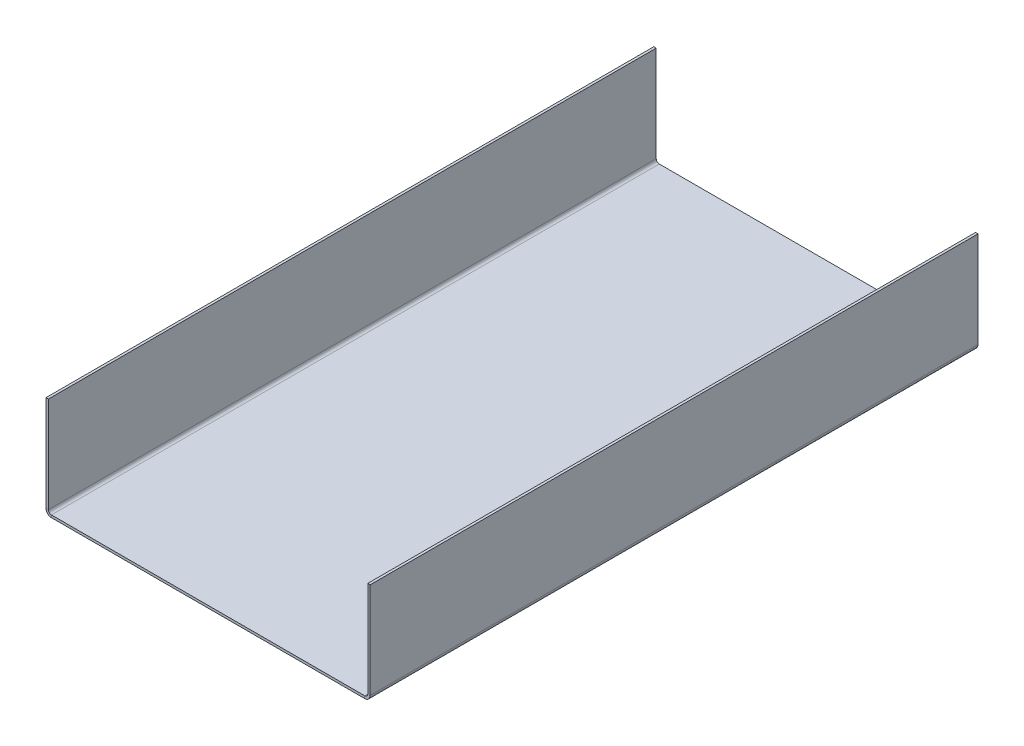
ISO-10303-21;
HEADER;
FILE_DESCRIPTION(('STEP AP214'),'2;1');
FILE_NAME('part.step','',(''),(''),'','','');
FILE_SCHEMA(('AUTOMOTIVE_DESIGN { 1 0 10303 214 1 1 1 1 }'));
ENDSEC;
DATA;
#1=APPLICATION_CONTEXT('core data for automotive mechanical design processes');
#2=APPLICATION_PROTOCOL_DEFINITION('international standard','automotive_design',2000,#1);
#3=PRODUCT_CONTEXT('',#1,'mechanical');
#4=PRODUCT('Part','Part','',(#3));
#5=PRODUCT_RELATED_PRODUCT_CATEGORY('part','',(#4));
#6=PRODUCT_DEFINITION_FORMATION('','',#4);
#7=PRODUCT_DEFINITION_CONTEXT('part definition',#1,'design');
#8=PRODUCT_DEFINITION('design','',#6,#7);
#9=PRODUCT_DEFINITION_SHAPE('','',#8);
#10=(LENGTH_UNIT() NAMED_UNIT(*) SI_UNIT(.MILLI.,.METRE.));
#11=(NAMED_UNIT(*) PLANE_ANGLE_UNIT() SI_UNIT($,.RADIAN.));
#12=(NAMED_UNIT(*) SI_UNIT($,.STERADIAN.) SOLID_ANGLE_UNIT());
#13=UNCERTAINTY_MEASURE_WITH_UNIT(LENGTH_MEASURE(1.E-05),#10,'distance_accuracy_value','');
#14=(GEOMETRIC_REPRESENTATION_CONTEXT(3) GLOBAL_UNCERTAINTY_ASSIGNED_CONTEXT((#13)) GLOBAL_UNIT_ASSIGNED_CONTEXT((#10,
#11,#12)) REPRESENTATION_CONTEXT('',''));
#15=CARTESIAN_POINT('',(0.,0.,0.));
#16=DIRECTION('',(0.,0.,1.));
#17=DIRECTION('',(1.,0.,0.));
#18=AXIS2_PLACEMENT_3D('',#15,#16,#17);
#19=CARTESIAN_POINT('',(199.77608,0.,381.));
#20=DIRECTION('',(0.,0.,1.));
#21=DIRECTION('',(1.,0.,0.));
#22=AXIS2_PLACEMENT_3D('',#19,#20,#21);
#23=PLANE('',#22);
#24=DIRECTION('',(0.,1.,0.));
#25=VECTOR('',#24,1.);
#26=CARTESIAN_POINT('',(199.77608,0.,381.));
#27=LINE('',#26,#25);
#28=CARTESIAN_POINT('',(199.77608,0.,381.));
#29=VERTEX_POINT('',#28);
#30=CARTESIAN_POINT('',(199.77608,1.51892,381.));
#31=VERTEX_POINT('',#30);
#32=EDGE_CURVE('E11',#29,#31,#27,.T.);
#33=ORIENTED_EDGE('',*,*,#32,.F.);
#34=CARTESIAN_POINT('',(199.77608,3.42392,381.));
#35=DIRECTION('',(0.,0.,1.));
#36=DIRECTION('',(1.,0.,0.));
#37=AXIS2_PLACEMENT_3D('',#34,#35,#36);
#38=CIRCLE('',#37,3.42392);
#39=CARTESIAN_POINT('',(203.2,3.42392,381.));
#40=VERTEX_POINT('',#39);
#41=EDGE_CURVE('E246',#40,#29,#38,.F.);
#42=ORIENTED_EDGE('',*,*,#41,.F.);
#43=DIRECTION('',(1.,0.,0.));
#44=VECTOR('',#43,1.);
#45=CARTESIAN_POINT('',(201.68108,3.42392,381.));
#46=LINE('',#45,#44);
#47=CARTESIAN_POINT('',(201.68108,3.42392,381.));
#48=VERTEX_POINT('',#47);
#49=EDGE_CURVE('E44',#48,#40,#46,.T.);
#50=ORIENTED_EDGE('',*,*,#49,.F.);
#51=CARTESIAN_POINT('',(199.77608,3.42392,381.));
#52=DIRECTION('',(0.,0.,1.));
#53=DIRECTION('',(1.,0.,0.));
#54=AXIS2_PLACEMENT_3D('',#51,#52,#53);
#55=CIRCLE('',#54,1.905);
#56=EDGE_CURVE('E145',#48,#31,#55,.F.);
#57=ORIENTED_EDGE('',*,*,#56,.T.);
#58=EDGE_LOOP('',(#33,#42,#50,#57));
#59=FACE_BOUND('',#58,.T.);
#60=ADVANCED_FACE('F36',(#59),#23,.T.);
#61=CARTESIAN_POINT('',(201.68108,3.42392,381.));
#62=DIRECTION('',(0.,0.,1.));
#63=DIRECTION('',(1.,0.,0.));
#64=AXIS2_PLACEMENT_3D('',#61,#62,#63);
#65=PLANE('',#64);
#66=DIRECTION('',(-1.,0.,0.));
#67=VECTOR('',#66,1.);
#68=CARTESIAN_POINT('',(0.,0.,381.));
#69=LINE('',#68,#67);
#70=CARTESIAN_POINT('',(3.42392,0.,381.));
#71=VERTEX_POINT('',#70);
#72=EDGE_CURVE('E139',#29,#71,#69,.T.);
#73=ORIENTED_EDGE('',*,*,#72,.F.);
#74=ORIENTED_EDGE('',*,*,#32,.T.);
#75=DIRECTION('',(1.,0.,0.));
#76=VECTOR('',#75,1.);
#77=CARTESIAN_POINT('',(0.,1.51892,381.));
#78=LINE('',#77,#76);
#79=CARTESIAN_POINT('',(3.42392,1.51892,381.));
#80=VERTEX_POINT('',#79);
#81=EDGE_CURVE('E136',#31,#80,#78,.F.);
#82=ORIENTED_EDGE('',*,*,#81,.T.);
#83=DIRECTION('',(0.,-1.,0.));
#84=VECTOR('',#83,1.);
#85=CARTESIAN_POINT('',(3.42392,1.51892,381.));
#86=LINE('',#85,#84);
#87=EDGE_CURVE('E227',#80,#71,#86,.T.);
#88=ORIENTED_EDGE('',*,*,#87,.T.);
#89=EDGE_LOOP('',(#73,#74,#82,#88));
#90=FACE_BOUND('',#89,.T.);
#91=ADVANCED_FACE('F134',(#90),#65,.T.);
#92=CARTESIAN_POINT('',(203.2,3.42392,0.));
#93=DIRECTION('',(0.,0.,-1.));
#94=DIRECTION('',(-1.,0.,0.));
#95=AXIS2_PLACEMENT_3D('',#92,#93,#94);
#96=PLANE('',#95);
#97=DIRECTION('',(-1.,0.,0.));
#98=VECTOR('',#97,1.);
#99=CARTESIAN_POINT('',(203.2,3.42392,0.));
#100=LINE('',#99,#98);
#101=CARTESIAN_POINT('',(203.2,3.42392,0.));
#102=VERTEX_POINT('',#101);
#103=CARTESIAN_POINT('',(201.68108,3.42392,0.));
#104=VERTEX_POINT('',#103);
#105=EDGE_CURVE('E232',#102,#104,#100,.T.);
#106=ORIENTED_EDGE('',*,*,#105,.F.);
#107=CARTESIAN_POINT('',(199.77608,3.42392,0.));
#108=DIRECTION('',(0.,0.,1.));
#109=DIRECTION('',(1.,0.,0.));
#110=AXIS2_PLACEMENT_3D('',#107,#108,#109);
#111=CIRCLE('',#110,3.42392);
#112=CARTESIAN_POINT('',(199.77608,0.,0.));
#113=VERTEX_POINT('',#112);
#114=EDGE_CURVE('E184',#102,#113,#111,.F.);
#115=ORIENTED_EDGE('',*,*,#114,.T.);
#116=DIRECTION('',(0.,-1.,0.));
#117=VECTOR('',#116,1.);
#118=CARTESIAN_POINT('',(199.77608,1.51892,0.));
#119=LINE('',#118,#117);
#120=CARTESIAN_POINT('',(199.77608,1.51892,0.));
#121=VERTEX_POINT('',#120);
#122=EDGE_CURVE('E230',#121,#113,#119,.T.);
#123=ORIENTED_EDGE('',*,*,#122,.F.);
#124=CARTESIAN_POINT('',(199.77608,3.42392,0.));
#125=DIRECTION('',(0.,0.,1.));
#126=DIRECTION('',(1.,0.,0.));
#127=AXIS2_PLACEMENT_3D('',#124,#125,#126);
#128=CIRCLE('',#127,1.905);
#129=EDGE_CURVE('E157',#104,#121,#128,.F.);
#130=ORIENTED_EDGE('',*,*,#129,.F.);
#131=EDGE_LOOP('',(#106,#115,#123,#130));
#132=FACE_BOUND('',#131,.T.);
#133=ADVANCED_FACE('F284',(#132),#96,.T.);
#134=CARTESIAN_POINT('',(199.77608,1.51892,0.));
#135=DIRECTION('',(0.,0.,-1.));
#136=DIRECTION('',(-1.,0.,0.));
#137=AXIS2_PLACEMENT_3D('',#134,#135,#136);
#138=PLANE('',#137);
#139=DIRECTION('',(0.,-1.,0.));
#140=VECTOR('',#139,1.);
#141=CARTESIAN_POINT('',(203.2,0.,0.));
#142=LINE('',#141,#140);
#143=CARTESIAN_POINT('',(203.2,63.5,0.));
#144=VERTEX_POINT('',#143);
#145=EDGE_CURVE('E187',#144,#102,#142,.T.);
#146=ORIENTED_EDGE('',*,*,#145,.T.);
#147=ORIENTED_EDGE('',*,*,#105,.T.);
#148=DIRECTION('',(0.,1.,0.));
#149=VECTOR('',#148,1.);
#150=CARTESIAN_POINT('',(201.68108,0.,0.));
#151=LINE('',#150,#149);
#152=CARTESIAN_POINT('',(201.68108,63.5,0.));
#153=VERTEX_POINT('',#152);
#154=EDGE_CURVE('E193',#153,#104,#151,.F.);
#155=ORIENTED_EDGE('',*,*,#154,.F.);
#156=DIRECTION('',(1.,0.,0.));
#157=VECTOR('',#156,1.);
#158=CARTESIAN_POINT('',(201.68108,63.5,0.));
#159=LINE('',#158,#157);
#160=EDGE_CURVE('E190',#153,#144,#159,.T.);
#161=ORIENTED_EDGE('',*,*,#160,.T.);
#162=EDGE_LOOP('',(#146,#147,#155,#161));
#163=FACE_BOUND('',#162,.T.);
#164=ADVANCED_FACE('F287',(#163),#138,.T.);
#165=CARTESIAN_POINT('',(0.,3.42392,381.));
#166=DIRECTION('',(0.,0.,1.));
#167=DIRECTION('',(1.,0.,0.));
#168=AXIS2_PLACEMENT_3D('',#165,#166,#167);
#169=PLANE('',#168);
#170=DIRECTION('',(1.,0.,0.));
#171=VECTOR('',#170,1.);
#172=CARTESIAN_POINT('',(0.,3.42392,381.));
#173=LINE('',#172,#171);
#174=CARTESIAN_POINT('',(0.,3.42392,381.));
#175=VERTEX_POINT('',#174);
#176=CARTESIAN_POINT('',(1.51892,3.42392,381.));
#177=VERTEX_POINT('',#176);
#178=EDGE_CURVE('E52',#175,#177,#173,.T.);
#179=ORIENTED_EDGE('',*,*,#178,.F.);
#180=CARTESIAN_POINT('',(3.42392,3.42392,381.));
#181=DIRECTION('',(0.,0.,1.));
#182=DIRECTION('',(1.,0.,0.));
#183=AXIS2_PLACEMENT_3D('',#180,#181,#182);
#184=CIRCLE('',#183,3.42392);
#185=EDGE_CURVE('E256',#71,#175,#184,.F.);
#186=ORIENTED_EDGE('',*,*,#185,.F.);
#187=ORIENTED_EDGE('',*,*,#87,.F.);
#188=CARTESIAN_POINT('',(3.42392,3.42392,381.));
#189=DIRECTION('',(0.,0.,1.));
#190=DIRECTION('',(1.,0.,0.));
#191=AXIS2_PLACEMENT_3D('',#188,#189,#190);
#192=CIRCLE('',#191,1.905);
#193=EDGE_CURVE('E165',#80,#177,#192,.F.);
#194=ORIENTED_EDGE('',*,*,#193,.T.);
#195=EDGE_LOOP('',(#179,#186,#187,#194));
#196=FACE_BOUND('',#195,.T.);
#197=ADVANCED_FACE('F279',(#196),#169,.T.);
#198=CARTESIAN_POINT('',(3.42392,1.51892,381.));
#199=DIRECTION('',(0.,0.,1.));
#200=DIRECTION('',(1.,0.,0.));
#201=AXIS2_PLACEMENT_3D('',#198,#199,#200);
#202=PLANE('',#201);
#203=DIRECTION('',(0.,1.,0.));
#204=VECTOR('',#203,1.);
#205=CARTESIAN_POINT('',(0.,0.,381.));
#206=LINE('',#205,#204);
#207=CARTESIAN_POINT('',(0.,63.5,381.));
#208=VERTEX_POINT('',#207);
#209=EDGE_CURVE('E259',#175,#208,#206,.T.);
#210=ORIENTED_EDGE('',*,*,#209,.F.);
#211=ORIENTED_EDGE('',*,*,#178,.T.);
#212=DIRECTION('',(0.,1.,0.));
#213=VECTOR('',#212,1.);
#214=CARTESIAN_POINT('',(1.51892,0.,381.));
#215=LINE('',#214,#213);
#216=CARTESIAN_POINT('',(1.51892,63.5,381.));
#217=VERTEX_POINT('',#216);
#218=EDGE_CURVE('E106',#177,#217,#215,.T.);
#219=ORIENTED_EDGE('',*,*,#218,.T.);
#220=DIRECTION('',(1.,0.,0.));
#221=VECTOR('',#220,1.);
#222=CARTESIAN_POINT('',(0.,63.5,381.));
#223=LINE('',#222,#221);
#224=EDGE_CURVE('E262',#208,#217,#223,.T.);
#225=ORIENTED_EDGE('',*,*,#224,.F.);
#226=EDGE_LOOP('',(#210,#211,#219,#225));
#227=FACE_BOUND('',#226,.T.);
#228=ADVANCED_FACE('F268',(#227),#202,.T.);
#229=CARTESIAN_POINT('',(3.42392,0.,0.));
#230=DIRECTION('',(0.,0.,-1.));
#231=DIRECTION('',(-1.,0.,0.));
#232=AXIS2_PLACEMENT_3D('',#229,#230,#231);
#233=PLANE('',#232);
#234=DIRECTION('',(0.,1.,0.));
#235=VECTOR('',#234,1.);
#236=CARTESIAN_POINT('',(3.42392,0.,0.));
#237=LINE('',#236,#235);
#238=CARTESIAN_POINT('',(3.42392,0.,0.));
#239=VERTEX_POINT('',#238);
#240=CARTESIAN_POINT('',(3.42392,1.51892,0.));
#241=VERTEX_POINT('',#240);
#242=EDGE_CURVE('E93',#239,#241,#237,.T.);
#243=ORIENTED_EDGE('',*,*,#242,.F.);
#244=CARTESIAN_POINT('',(3.42392,3.42392,0.));
#245=DIRECTION('',(0.,0.,1.));
#246=DIRECTION('',(1.,0.,0.));
#247=AXIS2_PLACEMENT_3D('',#244,#245,#246);
#248=CIRCLE('',#247,3.42392);
#249=CARTESIAN_POINT('',(0.,3.42392,0.));
#250=VERTEX_POINT('',#249);
#251=EDGE_CURVE('E180',#239,#250,#248,.F.);
#252=ORIENTED_EDGE('',*,*,#251,.T.);
#253=DIRECTION('',(-1.,0.,0.));
#254=VECTOR('',#253,1.);
#255=CARTESIAN_POINT('',(1.51892,3.42392,0.));
#256=LINE('',#255,#254);
#257=CARTESIAN_POINT('',(1.51892,3.42392,0.));
#258=VERTEX_POINT('',#257);
#259=EDGE_CURVE('E100',#258,#250,#256,.T.);
#260=ORIENTED_EDGE('',*,*,#259,.F.);
#261=CARTESIAN_POINT('',(3.42392,3.42392,0.));
#262=DIRECTION('',(0.,0.,1.));
#263=DIRECTION('',(1.,0.,0.));
#264=AXIS2_PLACEMENT_3D('',#261,#262,#263);
#265=CIRCLE('',#264,1.905);
#266=EDGE_CURVE('E199',#241,#258,#265,.F.);
#267=ORIENTED_EDGE('',*,*,#266,.F.);
#268=EDGE_LOOP('',(#243,#252,#260,#267));
#269=FACE_BOUND('',#268,.T.);
#270=ADVANCED_FACE('F316',(#269),#233,.T.);
#271=CARTESIAN_POINT('',(1.51892,3.42392,0.));
#272=DIRECTION('',(0.,0.,-1.));
#273=DIRECTION('',(-1.,0.,0.));
#274=AXIS2_PLACEMENT_3D('',#271,#272,#273);
#275=PLANE('',#274);
#276=DIRECTION('',(-1.,0.,0.));
#277=VECTOR('',#276,1.);
#278=CARTESIAN_POINT('',(0.,0.,0.));
#279=LINE('',#278,#277);
#280=EDGE_CURVE('E182',#113,#239,#279,.T.);
#281=ORIENTED_EDGE('',*,*,#280,.T.);
#282=ORIENTED_EDGE('',*,*,#242,.T.);
#283=DIRECTION('',(1.,0.,0.));
#284=VECTOR('',#283,1.);
#285=CARTESIAN_POINT('',(0.,1.51892,0.));
#286=LINE('',#285,#284);
#287=EDGE_CURVE('E197',#121,#241,#286,.F.);
#288=ORIENTED_EDGE('',*,*,#287,.F.);
#289=ORIENTED_EDGE('',*,*,#122,.T.);
#290=EDGE_LOOP('',(#281,#282,#288,#289));
#291=FACE_BOUND('',#290,.T.);
#292=ADVANCED_FACE('F319',(#291),#275,.T.);
#293=CARTESIAN_POINT('',(1.51892,0.,381.));
#294=DIRECTION('',(-1.,0.,0.));
#295=DIRECTION('',(0.,0.,1.));
#296=AXIS2_PLACEMENT_3D('',#293,#294,#295);
#297=PLANE('',#296);
#298=DIRECTION('',(0.,1.,0.));
#299=VECTOR('',#298,1.);
#300=CARTESIAN_POINT('',(1.51892,0.,0.));
#301=LINE('',#300,#299);
#302=CARTESIAN_POINT('',(1.51892,63.5,0.));
#303=VERTEX_POINT('',#302);
#304=EDGE_CURVE('E171',#258,#303,#301,.T.);
#305=ORIENTED_EDGE('',*,*,#304,.T.);
#306=DIRECTION('',(0.,0.,-1.));
#307=VECTOR('',#306,1.);
#308=CARTESIAN_POINT('',(1.51892,63.5,381.));
#309=LINE('',#308,#307);
#310=EDGE_CURVE('E223',#217,#303,#309,.T.);
#311=ORIENTED_EDGE('',*,*,#310,.F.);
#312=ORIENTED_EDGE('',*,*,#218,.F.);
#313=DIRECTION('',(0.,0.,-1.));
#314=VECTOR('',#313,1.);
#315=CARTESIAN_POINT('',(1.51892,3.42392,381.));
#316=LINE('',#315,#314);
#317=EDGE_CURVE('E167',#177,#258,#316,.T.);
#318=ORIENTED_EDGE('',*,*,#317,.T.);
#319=EDGE_LOOP('',(#305,#311,#312,#318));
#320=FACE_BOUND('',#319,.T.);
#321=ADVANCED_FACE('F322',(#320),#297,.F.);
#322=CARTESIAN_POINT('',(0.,63.5,381.));
#323=DIRECTION('',(0.,1.,0.));
#324=DIRECTION('',(0.,0.,1.));
#325=AXIS2_PLACEMENT_3D('',#322,#323,#324);
#326=PLANE('',#325);
#327=DIRECTION('',(1.,0.,0.));
#328=VECTOR('',#327,1.);
#329=CARTESIAN_POINT('',(0.,63.5,0.));
#330=LINE('',#329,#328);
#331=CARTESIAN_POINT('',(0.,63.5,0.));
#332=VERTEX_POINT('',#331);
#333=EDGE_CURVE('E174',#332,#303,#330,.T.);
#334=ORIENTED_EDGE('',*,*,#333,.F.);
#335=DIRECTION('',(0.,0.,-1.));
#336=VECTOR('',#335,1.);
#337=CARTESIAN_POINT('',(0.,63.5,381.));
#338=LINE('',#337,#336);
#339=EDGE_CURVE('E221',#208,#332,#338,.T.);
#340=ORIENTED_EDGE('',*,*,#339,.F.);
#341=ORIENTED_EDGE('',*,*,#224,.T.);
#342=ORIENTED_EDGE('',*,*,#310,.T.);
#343=EDGE_LOOP('',(#334,#340,#341,#342));
#344=FACE_BOUND('',#343,.T.);
#345=ADVANCED_FACE('F267',(#344),#326,.T.);
#346=CARTESIAN_POINT('',(0.,0.,381.));
#347=DIRECTION('',(-1.,0.,0.));
#348=DIRECTION('',(0.,0.,1.));
#349=AXIS2_PLACEMENT_3D('',#346,#347,#348);
#350=PLANE('',#349);
#351=DIRECTION('',(0.,1.,0.));
#352=VECTOR('',#351,1.);
#353=CARTESIAN_POINT('',(0.,0.,0.));
#354=LINE('',#353,#352);
#355=EDGE_CURVE('E177',#250,#332,#354,.T.);
#356=ORIENTED_EDGE('',*,*,#355,.F.);
#357=DIRECTION('',(0.,0.,-1.));
#358=VECTOR('',#357,1.);
#359=CARTESIAN_POINT('',(0.,3.42392,381.));
#360=LINE('',#359,#358);
#361=EDGE_CURVE('E218',#175,#250,#360,.T.);
#362=ORIENTED_EDGE('',*,*,#361,.F.);
#363=ORIENTED_EDGE('',*,*,#209,.T.);
#364=ORIENTED_EDGE('',*,*,#339,.T.);
#365=EDGE_LOOP('',(#356,#362,#363,#364));
#366=FACE_BOUND('',#365,.T.);
#367=ADVANCED_FACE('F272',(#366),#350,.T.);
#368=CARTESIAN_POINT('',(3.42392,3.42392,381.));
#369=DIRECTION('',(0.,0.,-1.));
#370=DIRECTION('',(-1.,0.,0.));
#371=AXIS2_PLACEMENT_3D('',#368,#369,#370);
#372=CYLINDRICAL_SURFACE('',#371,3.42392);
#373=ORIENTED_EDGE('',*,*,#251,.F.);
#374=DIRECTION('',(0.,0.,-1.));
#375=VECTOR('',#374,1.);
#376=CARTESIAN_POINT('',(3.42392,0.,381.));
#377=LINE('',#376,#375);
#378=EDGE_CURVE('E215',#71,#239,#377,.T.);
#379=ORIENTED_EDGE('',*,*,#378,.F.);
#380=ORIENTED_EDGE('',*,*,#185,.T.);
#381=ORIENTED_EDGE('',*,*,#361,.T.);
#382=EDGE_LOOP('',(#373,#379,#380,#381));
#383=FACE_BOUND('',#382,.T.);
#384=ADVANCED_FACE('F275',(#383),#372,.T.);
#385=CARTESIAN_POINT('',(0.,0.,381.));
#386=DIRECTION('',(0.,-1.,0.));
#387=DIRECTION('',(0.,0.,-1.));
#388=AXIS2_PLACEMENT_3D('',#385,#386,#387);
#389=PLANE('',#388);
#390=ORIENTED_EDGE('',*,*,#280,.F.);
#391=DIRECTION('',(0.,0.,-1.));
#392=VECTOR('',#391,1.);
#393=CARTESIAN_POINT('',(199.77608,0.,381.));
#394=LINE('',#393,#392);
#395=EDGE_CURVE('E212',#29,#113,#394,.T.);
#396=ORIENTED_EDGE('',*,*,#395,.F.);
#397=ORIENTED_EDGE('',*,*,#72,.T.);
#398=ORIENTED_EDGE('',*,*,#378,.T.);
#399=EDGE_LOOP('',(#390,#396,#397,#398));
#400=FACE_BOUND('',#399,.T.);
#401=ADVANCED_FACE('F282',(#400),#389,.T.);
#402=CARTESIAN_POINT('',(199.77608,3.42392,381.));
#403=DIRECTION('',(0.,0.,-1.));
#404=DIRECTION('',(-1.,0.,0.));
#405=AXIS2_PLACEMENT_3D('',#402,#403,#404);
#406=CYLINDRICAL_SURFACE('',#405,3.42392);
#407=ORIENTED_EDGE('',*,*,#114,.F.);
#408=DIRECTION('',(0.,0.,-1.));
#409=VECTOR('',#408,1.);
#410=CARTESIAN_POINT('',(203.2,3.42392,381.));
#411=LINE('',#410,#409);
#412=EDGE_CURVE('E209',#40,#102,#411,.T.);
#413=ORIENTED_EDGE('',*,*,#412,.F.);
#414=ORIENTED_EDGE('',*,*,#41,.T.);
#415=ORIENTED_EDGE('',*,*,#395,.T.);
#416=EDGE_LOOP('',(#407,#413,#414,#415));
#417=FACE_BOUND('',#416,.T.);
#418=ADVANCED_FACE('F245',(#417),#406,.T.);
#419=CARTESIAN_POINT('',(203.2,0.,381.));
#420=DIRECTION('',(1.,0.,0.));
#421=DIRECTION('',(0.,0.,-1.));
#422=AXIS2_PLACEMENT_3D('',#419,#420,#421);
#423=PLANE('',#422);
#424=ORIENTED_EDGE('',*,*,#145,.F.);
#425=DIRECTION('',(0.,0.,-1.));
#426=VECTOR('',#425,1.);
#427=CARTESIAN_POINT('',(203.2,63.5,381.));
#428=LINE('',#427,#426);
#429=CARTESIAN_POINT('',(203.2,63.5,381.));
#430=VERTEX_POINT('',#429);
#431=EDGE_CURVE('E207',#430,#144,#428,.T.);
#432=ORIENTED_EDGE('',*,*,#431,.F.);
#433=DIRECTION('',(0.,-1.,0.));
#434=VECTOR('',#433,1.);
#435=CARTESIAN_POINT('',(203.2,0.,381.));
#436=LINE('',#435,#434);
#437=EDGE_CURVE('E239',#430,#40,#436,.T.);
#438=ORIENTED_EDGE('',*,*,#437,.T.);
#439=ORIENTED_EDGE('',*,*,#412,.T.);
#440=EDGE_LOOP('',(#424,#432,#438,#439));
#441=FACE_BOUND('',#440,.T.);
#442=ADVANCED_FACE('F250',(#441),#423,.T.);
#443=CARTESIAN_POINT('',(201.68108,63.5,381.));
#444=DIRECTION('',(0.,1.,0.));
#445=DIRECTION('',(0.,0.,1.));
#446=AXIS2_PLACEMENT_3D('',#443,#444,#445);
#447=PLANE('',#446);
#448=ORIENTED_EDGE('',*,*,#160,.F.);
#449=DIRECTION('',(0.,0.,-1.));
#450=VECTOR('',#449,1.);
#451=CARTESIAN_POINT('',(201.68108,63.5,381.));
#452=LINE('',#451,#450);
#453=CARTESIAN_POINT('',(201.68108,63.5,381.));
#454=VERTEX_POINT('',#453);
#455=EDGE_CURVE('E205',#454,#153,#452,.T.);
#456=ORIENTED_EDGE('',*,*,#455,.F.);
#457=DIRECTION('',(1.,0.,0.));
#458=VECTOR('',#457,1.);
#459=CARTESIAN_POINT('',(201.68108,63.5,381.));
#460=LINE('',#459,#458);
#461=EDGE_CURVE('E251',#454,#430,#460,.T.);
#462=ORIENTED_EDGE('',*,*,#461,.T.);
#463=ORIENTED_EDGE('',*,*,#431,.T.);
#464=EDGE_LOOP('',(#448,#456,#462,#463));
#465=FACE_BOUND('',#464,.T.);
#466=ADVANCED_FACE('F292',(#465),#447,.T.);
#467=CARTESIAN_POINT('',(201.68108,0.,381.));
#468=DIRECTION('',(1.,0.,0.));
#469=DIRECTION('',(0.,0.,-1.));
#470=AXIS2_PLACEMENT_3D('',#467,#468,#469);
#471=PLANE('',#470);
#472=ORIENTED_EDGE('',*,*,#154,.T.);
#473=DIRECTION('',(0.,0.,-1.));
#474=VECTOR('',#473,1.);
#475=CARTESIAN_POINT('',(201.68108,3.42392,381.));
#476=LINE('',#475,#474);
#477=EDGE_CURVE('E159',#48,#104,#476,.T.);
#478=ORIENTED_EDGE('',*,*,#477,.F.);
#479=DIRECTION('',(0.,1.,0.));
#480=VECTOR('',#479,1.);
#481=CARTESIAN_POINT('',(201.68108,0.,381.));
#482=LINE('',#481,#480);
#483=EDGE_CURVE('E150',#454,#48,#482,.F.);
#484=ORIENTED_EDGE('',*,*,#483,.F.);
#485=ORIENTED_EDGE('',*,*,#455,.T.);
#486=EDGE_LOOP('',(#472,#478,#484,#485));
#487=FACE_BOUND('',#486,.T.);
#488=ADVANCED_FACE('F290',(#487),#471,.F.);
#489=CARTESIAN_POINT('',(199.77608,3.42392,381.));
#490=DIRECTION('',(0.,0.,-1.));
#491=DIRECTION('',(-1.,0.,0.));
#492=AXIS2_PLACEMENT_3D('',#489,#490,#491);
#493=CYLINDRICAL_SURFACE('',#492,1.905);
#494=ORIENTED_EDGE('',*,*,#129,.T.);
#495=DIRECTION('',(0.,0.,-1.));
#496=VECTOR('',#495,1.);
#497=CARTESIAN_POINT('',(199.77608,1.51892,381.));
#498=LINE('',#497,#496);
#499=EDGE_CURVE('E154',#31,#121,#498,.T.);
#500=ORIENTED_EDGE('',*,*,#499,.F.);
#501=ORIENTED_EDGE('',*,*,#56,.F.);
#502=ORIENTED_EDGE('',*,*,#477,.T.);
#503=EDGE_LOOP('',(#494,#500,#501,#502));
#504=FACE_BOUND('',#503,.T.);
#505=ADVANCED_FACE('F155',(#504),#493,.F.);
#506=CARTESIAN_POINT('',(0.,1.51892,381.));
#507=DIRECTION('',(0.,-1.,0.));
#508=DIRECTION('',(0.,0.,-1.));
#509=AXIS2_PLACEMENT_3D('',#506,#507,#508);
#510=PLANE('',#509);
#511=ORIENTED_EDGE('',*,*,#287,.T.);
#512=DIRECTION('',(0.,0.,-1.));
#513=VECTOR('',#512,1.);
#514=CARTESIAN_POINT('',(3.42392,1.51892,381.));
#515=LINE('',#514,#513);
#516=EDGE_CURVE('E160',#80,#241,#515,.T.);
#517=ORIENTED_EDGE('',*,*,#516,.F.);
#518=ORIENTED_EDGE('',*,*,#81,.F.);
#519=ORIENTED_EDGE('',*,*,#499,.T.);
#520=EDGE_LOOP('',(#511,#517,#518,#519));
#521=FACE_BOUND('',#520,.T.);
#522=ADVANCED_FACE('F162',(#521),#510,.F.);
#523=CARTESIAN_POINT('',(3.42392,3.42392,381.));
#524=DIRECTION('',(0.,0.,-1.));
#525=DIRECTION('',(-1.,0.,0.));
#526=AXIS2_PLACEMENT_3D('',#523,#524,#525);
#527=CYLINDRICAL_SURFACE('',#526,1.905);
#528=ORIENTED_EDGE('',*,*,#266,.T.);
#529=ORIENTED_EDGE('',*,*,#317,.F.);
#530=ORIENTED_EDGE('',*,*,#193,.F.);
#531=ORIENTED_EDGE('',*,*,#516,.T.);
#532=EDGE_LOOP('',(#528,#529,#530,#531));
#533=FACE_BOUND('',#532,.T.);
#534=ADVANCED_FACE('F374',(#533),#527,.F.);
#535=CARTESIAN_POINT('',(3.42392,3.42392,381.));
#536=DIRECTION('',(0.,0.,1.));
#537=DIRECTION('',(1.,0.,0.));
#538=AXIS2_PLACEMENT_3D('',#535,#536,#537);
#539=PLANE('',#538);
#540=ORIENTED_EDGE('',*,*,#483,.T.);
#541=ORIENTED_EDGE('',*,*,#49,.T.);
#542=ORIENTED_EDGE('',*,*,#437,.F.);
#543=ORIENTED_EDGE('',*,*,#461,.F.);
#544=EDGE_LOOP('',(#540,#541,#542,#543));
#545=FACE_BOUND('',#544,.T.);
#546=ADVANCED_FACE('F236',(#545),#539,.T.);
#547=CARTESIAN_POINT('',(3.42392,3.42392,0.));
#548=DIRECTION('',(0.,0.,1.));
#549=DIRECTION('',(1.,0.,0.));
#550=AXIS2_PLACEMENT_3D('',#547,#548,#549);
#551=PLANE('',#550);
#552=ORIENTED_EDGE('',*,*,#304,.F.);
#553=ORIENTED_EDGE('',*,*,#259,.T.);
#554=ORIENTED_EDGE('',*,*,#355,.T.);
#555=ORIENTED_EDGE('',*,*,#333,.T.);
#556=EDGE_LOOP('',(#552,#553,#554,#555));
#557=FACE_BOUND('',#556,.T.);
#558=ADVANCED_FACE('F394',(#557),#551,.F.);
#559=CLOSED_SHELL('',(#60,#91,#133,#164,#197,#228,#270,#292,#321,#345,#367,#384,#401,#418,#442,
#466,#488,#505,#522,#534,#546,#558));
#560=MANIFOLD_SOLID_BREP('B2',#559);
#561=ADVANCED_BREP_SHAPE_REPRESENTATION('',(#18,#560),#14);
#562=SHAPE_DEFINITION_REPRESENTATION(#9,#561);
ENDSEC;
END-ISO-10303-21;
